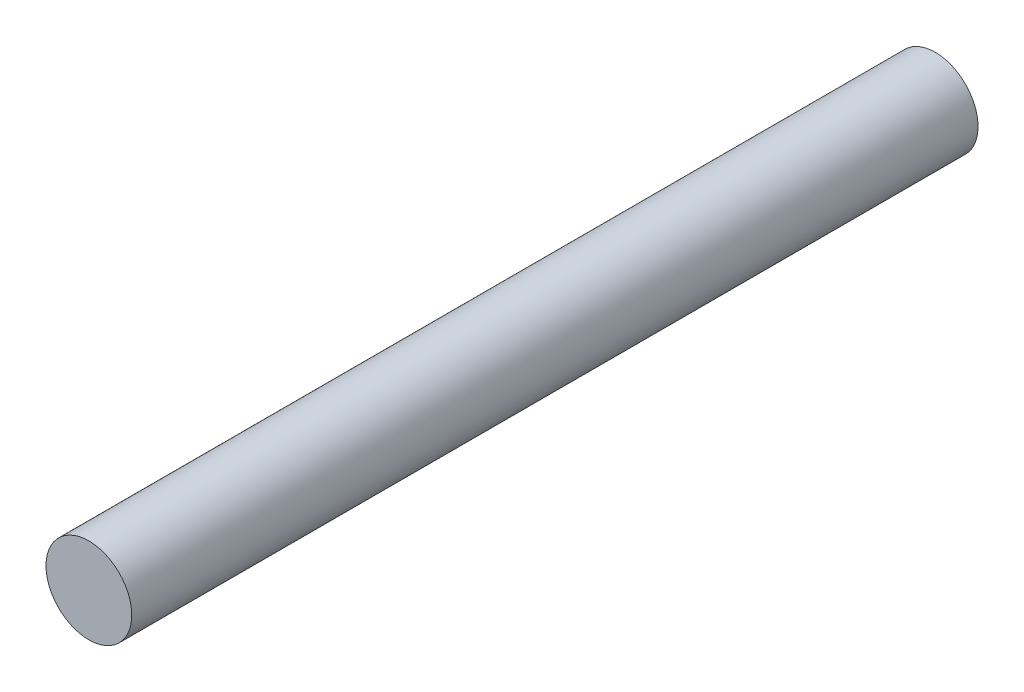
ISO-10303-21;
HEADER;
FILE_DESCRIPTION(('STEP AP214'),'2;1');
FILE_NAME('part.step','',(''),(''),'','','');
FILE_SCHEMA(('AUTOMOTIVE_DESIGN { 1 0 10303 214 1 1 1 1 }'));
ENDSEC;
DATA;
#1=APPLICATION_CONTEXT('core data for automotive mechanical design processes');
#2=APPLICATION_PROTOCOL_DEFINITION('international standard','automotive_design',2000,#1);
#3=PRODUCT_CONTEXT('',#1,'mechanical');
#4=PRODUCT('Part','Part','',(#3));
#5=PRODUCT_RELATED_PRODUCT_CATEGORY('part','',(#4));
#6=PRODUCT_DEFINITION_FORMATION('','',#4);
#7=PRODUCT_DEFINITION_CONTEXT('part definition',#1,'design');
#8=PRODUCT_DEFINITION('design','',#6,#7);
#9=PRODUCT_DEFINITION_SHAPE('','',#8);
#10=(LENGTH_UNIT() NAMED_UNIT(*) SI_UNIT(.MILLI.,.METRE.));
#11=(NAMED_UNIT(*) PLANE_ANGLE_UNIT() SI_UNIT($,.RADIAN.));
#12=(NAMED_UNIT(*) SI_UNIT($,.STERADIAN.) SOLID_ANGLE_UNIT());
#13=UNCERTAINTY_MEASURE_WITH_UNIT(LENGTH_MEASURE(1.E-05),#10,'distance_accuracy_value','');
#14=(GEOMETRIC_REPRESENTATION_CONTEXT(3) GLOBAL_UNCERTAINTY_ASSIGNED_CONTEXT((#13)) GLOBAL_UNIT_ASSIGNED_CONTEXT((#10,
#11,#12)) REPRESENTATION_CONTEXT('',''));
#15=CARTESIAN_POINT('',(0.,0.,0.));
#16=DIRECTION('',(0.,0.,1.));
#17=DIRECTION('',(1.,0.,0.));
#18=AXIS2_PLACEMENT_3D('',#15,#16,#17);
#19=CARTESIAN_POINT('',(221.855607159305,-9.48765579701671,123.4));
#20=DIRECTION('',(0.,0.,-1.));
#21=DIRECTION('',(-1.,0.,0.));
#22=AXIS2_PLACEMENT_3D('',#19,#20,#21);
#23=CYLINDRICAL_SURFACE('',#22,6.25);
#24=CARTESIAN_POINT('',(221.855607159305,-9.48765579701671,123.4));
#25=DIRECTION('',(0.,0.,1.));
#26=DIRECTION('',(1.,0.,0.));
#27=AXIS2_PLACEMENT_3D('',#24,#25,#26);
#28=CIRCLE('',#27,6.25);
#29=CARTESIAN_POINT('',(215.605607159305,-9.48765579701671,123.4));
#30=VERTEX_POINT('',#29);
#31=EDGE_CURVE('E10',#30,#30,#28,.T.);
#32=CARTESIAN_POINT('',(221.855607159305,-9.48765579701671,0.));
#33=DIRECTION('',(0.,0.,1.));
#34=DIRECTION('',(1.,0.,0.));
#35=AXIS2_PLACEMENT_3D('',#32,#33,#34);
#36=CIRCLE('',#35,6.25);
#37=CARTESIAN_POINT('',(215.605607159305,-9.48765579701671,0.));
#38=VERTEX_POINT('',#37);
#39=EDGE_CURVE('E34',#38,#38,#36,.T.);
#40=CARTESIAN_POINT('',(215.605607159305,-9.48765579701671,123.4));
#41=CARTESIAN_POINT('',(215.605607159305,-9.48765579701671,122.114583333333));
#42=CARTESIAN_POINT('',(215.605607159305,-9.48765579701671,120.829166666667));
#43=CARTESIAN_POINT('',(215.605607159305,-9.48765579701671,118.258333333333));
#44=CARTESIAN_POINT('',(215.605607159305,-9.48765579701671,116.972916666667));
#45=CARTESIAN_POINT('',(215.605607159305,-9.48765579701671,114.402083333333));
#46=CARTESIAN_POINT('',(215.605607159305,-9.48765579701671,113.116666666667));
#47=CARTESIAN_POINT('',(215.605607159305,-9.48765579701671,110.545833333333));
#48=CARTESIAN_POINT('',(215.605607159305,-9.48765579701671,109.260416666667));
#49=CARTESIAN_POINT('',(215.605607159305,-9.48765579701671,106.689583333333));
#50=CARTESIAN_POINT('',(215.605607159305,-9.48765579701671,105.404166666667));
#51=CARTESIAN_POINT('',(215.605607159305,-9.48765579701671,102.833333333333));
#52=CARTESIAN_POINT('',(215.605607159305,-9.48765579701671,101.547916666667));
#53=CARTESIAN_POINT('',(215.605607159305,-9.48765579701671,98.9770833333333));
#54=CARTESIAN_POINT('',(215.605607159305,-9.48765579701671,97.6916666666667));
#55=CARTESIAN_POINT('',(215.605607159305,-9.48765579701671,95.1208333333333));
#56=CARTESIAN_POINT('',(215.605607159305,-9.48765579701671,93.8354166666667));
#57=CARTESIAN_POINT('',(215.605607159305,-9.48765579701671,91.2645833333333));
#58=CARTESIAN_POINT('',(215.605607159305,-9.48765579701671,89.9791666666667));
#59=CARTESIAN_POINT('',(215.605607159305,-9.48765579701671,87.4083333333333));
#60=CARTESIAN_POINT('',(215.605607159305,-9.48765579701671,86.1229166666667));
#61=CARTESIAN_POINT('',(215.605607159305,-9.48765579701671,83.5520833333333));
#62=CARTESIAN_POINT('',(215.605607159305,-9.48765579701671,82.2666666666667));
#63=CARTESIAN_POINT('',(215.605607159305,-9.48765579701671,79.6958333333333));
#64=CARTESIAN_POINT('',(215.605607159305,-9.48765579701671,78.4104166666667));
#65=CARTESIAN_POINT('',(215.605607159305,-9.48765579701671,75.8395833333333));
#66=CARTESIAN_POINT('',(215.605607159305,-9.48765579701671,74.5541666666667));
#67=CARTESIAN_POINT('',(215.605607159305,-9.48765579701671,71.9833333333333));
#68=CARTESIAN_POINT('',(215.605607159305,-9.48765579701671,70.6979166666667));
#69=CARTESIAN_POINT('',(215.605607159305,-9.48765579701671,68.1270833333333));
#70=CARTESIAN_POINT('',(215.605607159305,-9.48765579701671,66.8416666666667));
#71=CARTESIAN_POINT('',(215.605607159305,-9.48765579701671,64.2708333333333));
#72=CARTESIAN_POINT('',(215.605607159305,-9.48765579701671,62.9854166666667));
#73=CARTESIAN_POINT('',(215.605607159305,-9.48765579701671,60.4145833333333));
#74=CARTESIAN_POINT('',(215.605607159305,-9.48765579701671,59.1291666666667));
#75=CARTESIAN_POINT('',(215.605607159305,-9.48765579701671,56.5583333333333));
#76=CARTESIAN_POINT('',(215.605607159305,-9.48765579701671,55.2729166666667));
#77=CARTESIAN_POINT('',(215.605607159305,-9.48765579701671,52.7020833333333));
#78=CARTESIAN_POINT('',(215.605607159305,-9.48765579701671,51.4166666666667));
#79=CARTESIAN_POINT('',(215.605607159305,-9.48765579701671,48.8458333333333));
#80=CARTESIAN_POINT('',(215.605607159305,-9.48765579701671,47.5604166666667));
#81=CARTESIAN_POINT('',(215.605607159305,-9.48765579701671,44.9895833333333));
#82=CARTESIAN_POINT('',(215.605607159305,-9.48765579701671,43.7041666666667));
#83=CARTESIAN_POINT('',(215.605607159305,-9.48765579701671,41.1333333333333));
#84=CARTESIAN_POINT('',(215.605607159305,-9.48765579701671,39.8479166666667));
#85=CARTESIAN_POINT('',(215.605607159305,-9.48765579701671,37.2770833333333));
#86=CARTESIAN_POINT('',(215.605607159305,-9.48765579701671,35.9916666666667));
#87=CARTESIAN_POINT('',(215.605607159305,-9.48765579701671,33.4208333333333));
#88=CARTESIAN_POINT('',(215.605607159305,-9.48765579701671,32.1354166666667));
#89=CARTESIAN_POINT('',(215.605607159305,-9.48765579701671,29.5645833333333));
#90=CARTESIAN_POINT('',(215.605607159305,-9.48765579701671,28.2791666666667));
#91=CARTESIAN_POINT('',(215.605607159305,-9.48765579701671,25.7083333333333));
#92=CARTESIAN_POINT('',(215.605607159305,-9.48765579701671,24.4229166666667));
#93=CARTESIAN_POINT('',(215.605607159305,-9.48765579701671,21.8520833333333));
#94=CARTESIAN_POINT('',(215.605607159305,-9.48765579701671,20.5666666666667));
#95=CARTESIAN_POINT('',(215.605607159305,-9.48765579701671,17.9958333333333));
#96=CARTESIAN_POINT('',(215.605607159305,-9.48765579701671,16.7104166666667));
#97=CARTESIAN_POINT('',(215.605607159305,-9.48765579701671,14.1395833333333));
#98=CARTESIAN_POINT('',(215.605607159305,-9.48765579701671,12.8541666666667));
#99=CARTESIAN_POINT('',(215.605607159305,-9.48765579701671,10.2833333333333));
#100=CARTESIAN_POINT('',(215.605607159305,-9.48765579701671,8.99791666666667));
#101=CARTESIAN_POINT('',(215.605607159305,-9.48765579701671,6.42708333333333));
#102=CARTESIAN_POINT('',(215.605607159305,-9.48765579701671,5.14166666666667));
#103=CARTESIAN_POINT('',(215.605607159305,-9.48765579701671,2.57083333333334));
#104=CARTESIAN_POINT('',(215.605607159305,-9.48765579701671,1.28541666666667));
#105=CARTESIAN_POINT('',(215.605607159305,-9.48765579701671,0.));
#106=B_SPLINE_CURVE_WITH_KNOTS('',3,(#40,#41,#42,#43,#44,#45,#46,#47,#48,#49,#50,#51,#52,#53,
#54,#55,#56,#57,#58,#59,#60,#61,#62,#63,#64,#65,#66,#67,#68,#69,#70,#71,#72,#73,#74,#75,#76,#77,
#78,#79,#80,#81,#82,#83,#84,#85,#86,#87,#88,#89,#90,#91,#92,#93,#94,#95,#96,#97,#98,#99,#100,
#101,#102,#103,#104,#105),.UNSPECIFIED.,.F.,.F.,(4,2,2,2,2,2,2,2,2,2,2,2,2,2,2,2,2,2,2,2,2,2,2,
2,2,2,2,2,2,2,2,2,4),(0.,3.85624999999999,7.7125,11.56875,15.425,19.28125,23.1375,26.99375,
30.85,34.70625,38.5625,42.41875,46.275,50.13125,53.9875,57.84375,61.7,65.55625,69.4125,73.26875,
77.125,80.98125,84.8375,88.69375,92.55,96.40625,100.2625,104.11875,107.975,111.83125,115.6875,
119.54375,123.4),.UNSPECIFIED.);
#107=EDGE_CURVE('BSEAM31',#30,#38,#106,.T.);
#108=ORIENTED_EDGE('',*,*,#31,.F.);
#109=ORIENTED_EDGE('',*,*,#39,.T.);
#110=ORIENTED_EDGE('',*,*,#107,.T.);
#111=ORIENTED_EDGE('',*,*,#107,.F.);
#112=EDGE_LOOP('',(#108,#110,#109,#111));
#113=FACE_BOUND('',#112,.T.);
#114=ADVANCED_FACE('F31',(#113),#23,.T.);
#115=CARTESIAN_POINT('',(221.855607159305,-9.48765579701671,123.4));
#116=DIRECTION('',(0.,0.,1.));
#117=DIRECTION('',(1.,0.,0.));
#118=AXIS2_PLACEMENT_3D('',#115,#116,#117);
#119=PLANE('',#118);
#120=ORIENTED_EDGE('',*,*,#31,.T.);
#121=EDGE_LOOP('',(#120));
#122=FACE_BOUND('',#121,.T.);
#123=ADVANCED_FACE('F46',(#122),#119,.T.);
#124=CARTESIAN_POINT('',(221.855607159305,-9.48765579701671,0.));
#125=DIRECTION('',(0.,0.,1.));
#126=DIRECTION('',(1.,0.,0.));
#127=AXIS2_PLACEMENT_3D('',#124,#125,#126);
#128=PLANE('',#127);
#129=ORIENTED_EDGE('',*,*,#39,.F.);
#130=EDGE_LOOP('',(#129));
#131=FACE_BOUND('',#130,.T.);
#132=ADVANCED_FACE('F44',(#131),#128,.F.);
#133=CLOSED_SHELL('',(#114,#123,#132));
#134=MANIFOLD_SOLID_BREP('B2',#133);
#135=ADVANCED_BREP_SHAPE_REPRESENTATION('',(#18,#134),#14);
#136=SHAPE_DEFINITION_REPRESENTATION(#9,#135);
ENDSEC;
END-ISO-10303-21;
